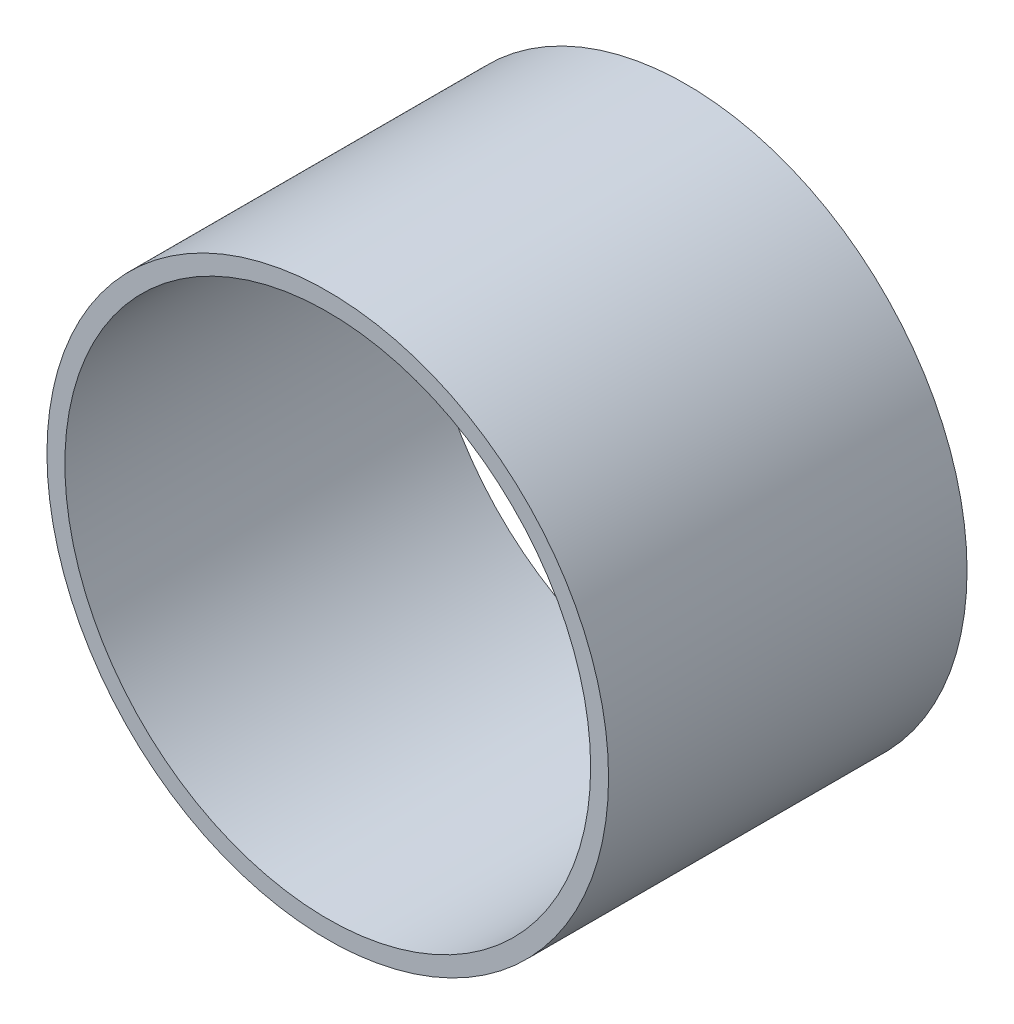
ISO-10303-21;
HEADER;
FILE_DESCRIPTION(('STEP AP214'),'2;1');
FILE_NAME('part.step','',(''),(''),'','','');
FILE_SCHEMA(('AUTOMOTIVE_DESIGN { 1 0 10303 214 1 1 1 1 }'));
ENDSEC;
DATA;
#1=APPLICATION_CONTEXT('core data for automotive mechanical design processes');
#2=APPLICATION_PROTOCOL_DEFINITION('international standard','automotive_design',2000,#1);
#3=PRODUCT_CONTEXT('',#1,'mechanical');
#4=PRODUCT('Part','Part','',(#3));
#5=PRODUCT_RELATED_PRODUCT_CATEGORY('part','',(#4));
#6=PRODUCT_DEFINITION_FORMATION('','',#4);
#7=PRODUCT_DEFINITION_CONTEXT('part definition',#1,'design');
#8=PRODUCT_DEFINITION('design','',#6,#7);
#9=PRODUCT_DEFINITION_SHAPE('','',#8);
#10=(LENGTH_UNIT() NAMED_UNIT(*) SI_UNIT(.MILLI.,.METRE.));
#11=(NAMED_UNIT(*) PLANE_ANGLE_UNIT() SI_UNIT($,.RADIAN.));
#12=(NAMED_UNIT(*) SI_UNIT($,.STERADIAN.) SOLID_ANGLE_UNIT());
#13=UNCERTAINTY_MEASURE_WITH_UNIT(LENGTH_MEASURE(1.E-05),#10,'distance_accuracy_value','');
#14=(GEOMETRIC_REPRESENTATION_CONTEXT(3) GLOBAL_UNCERTAINTY_ASSIGNED_CONTEXT((#13)) GLOBAL_UNIT_ASSIGNED_CONTEXT((#10,
#11,#12)) REPRESENTATION_CONTEXT('',''));
#15=CARTESIAN_POINT('',(0.,0.,0.));
#16=DIRECTION('',(0.,0.,1.));
#17=DIRECTION('',(1.,0.,0.));
#18=AXIS2_PLACEMENT_3D('',#15,#16,#17);
#19=CARTESIAN_POINT('',(0.,0.,762.));
#20=DIRECTION('',(0.,0.,-1.));
#21=DIRECTION('',(-1.,0.,0.));
#22=AXIS2_PLACEMENT_3D('',#19,#20,#21);
#23=CYLINDRICAL_SURFACE('',#22,596.9);
#24=CARTESIAN_POINT('',(0.,0.,762.));
#25=DIRECTION('',(0.,0.,1.));
#26=DIRECTION('',(1.,0.,0.));
#27=AXIS2_PLACEMENT_3D('',#24,#25,#26);
#28=CIRCLE('',#27,596.9);
#29=CARTESIAN_POINT('',(596.9,0.,762.));
#30=VERTEX_POINT('',#29);
#31=EDGE_CURVE('E10',#30,#30,#28,.T.);
#32=ORIENTED_EDGE('',*,*,#31,.F.);
#33=EDGE_LOOP('',(#32));
#34=FACE_BOUND('',#33,.T.);
#35=CARTESIAN_POINT('',(0.,0.,0.));
#36=DIRECTION('',(0.,0.,1.));
#37=DIRECTION('',(1.,0.,0.));
#38=AXIS2_PLACEMENT_3D('',#35,#36,#37);
#39=CIRCLE('',#38,596.9);
#40=CARTESIAN_POINT('',(596.9,0.,0.));
#41=VERTEX_POINT('',#40);
#42=EDGE_CURVE('E38',#41,#41,#39,.T.);
#43=ORIENTED_EDGE('',*,*,#42,.T.);
#44=EDGE_LOOP('',(#43));
#45=FACE_BOUND('',#44,.T.);
#46=ADVANCED_FACE('F35',(#34,#45),#23,.T.);
#47=CARTESIAN_POINT('',(0.,0.,762.));
#48=DIRECTION('',(0.,0.,1.));
#49=DIRECTION('',(1.,0.,0.));
#50=AXIS2_PLACEMENT_3D('',#47,#48,#49);
#51=PLANE('',#50);
#52=CARTESIAN_POINT('',(0.,0.,762.));
#53=DIRECTION('',(0.,0.,1.));
#54=DIRECTION('',(1.,0.,0.));
#55=AXIS2_PLACEMENT_3D('',#52,#53,#54);
#56=CIRCLE('',#55,558.8);
#57=CARTESIAN_POINT('',(558.8,0.,762.));
#58=VERTEX_POINT('',#57);
#59=EDGE_CURVE('E47',#58,#58,#56,.T.);
#60=ORIENTED_EDGE('',*,*,#59,.F.);
#61=EDGE_LOOP('',(#60));
#62=FACE_BOUND('',#61,.T.);
#63=ORIENTED_EDGE('',*,*,#31,.T.);
#64=EDGE_LOOP('',(#63));
#65=FACE_BOUND('',#64,.T.);
#66=ADVANCED_FACE('F62',(#62,#65),#51,.T.);
#67=CARTESIAN_POINT('',(0.,0.,0.));
#68=DIRECTION('',(0.,0.,1.));
#69=DIRECTION('',(1.,0.,0.));
#70=AXIS2_PLACEMENT_3D('',#67,#68,#69);
#71=PLANE('',#70);
#72=CARTESIAN_POINT('',(0.,0.,0.));
#73=DIRECTION('',(0.,0.,1.));
#74=DIRECTION('',(1.,0.,0.));
#75=AXIS2_PLACEMENT_3D('',#72,#73,#74);
#76=CIRCLE('',#75,558.8);
#77=CARTESIAN_POINT('',(558.8,0.,0.));
#78=VERTEX_POINT('',#77);
#79=EDGE_CURVE('E45',#78,#78,#76,.T.);
#80=ORIENTED_EDGE('',*,*,#79,.T.);
#81=EDGE_LOOP('',(#80));
#82=FACE_BOUND('',#81,.T.);
#83=ORIENTED_EDGE('',*,*,#42,.F.);
#84=EDGE_LOOP('',(#83));
#85=FACE_BOUND('',#84,.T.);
#86=ADVANCED_FACE('F53',(#82,#85),#71,.F.);
#87=CARTESIAN_POINT('',(0.,0.,0.));
#88=DIRECTION('',(0.,0.,1.));
#89=DIRECTION('',(1.,0.,0.));
#90=AXIS2_PLACEMENT_3D('',#87,#88,#89);
#91=CYLINDRICAL_SURFACE('',#90,558.8);
#92=ORIENTED_EDGE('',*,*,#79,.F.);
#93=EDGE_LOOP('',(#92));
#94=FACE_BOUND('',#93,.T.);
#95=ORIENTED_EDGE('',*,*,#59,.T.);
#96=EDGE_LOOP('',(#95));
#97=FACE_BOUND('',#96,.T.);
#98=ADVANCED_FACE('F56',(#94,#97),#91,.F.);
#99=CLOSED_SHELL('',(#46,#66,#86,#98));
#100=MANIFOLD_SOLID_BREP('B2',#99);
#101=ADVANCED_BREP_SHAPE_REPRESENTATION('',(#18,#100),#14);
#102=SHAPE_DEFINITION_REPRESENTATION(#9,#101);
ENDSEC;
END-ISO-10303-21;
